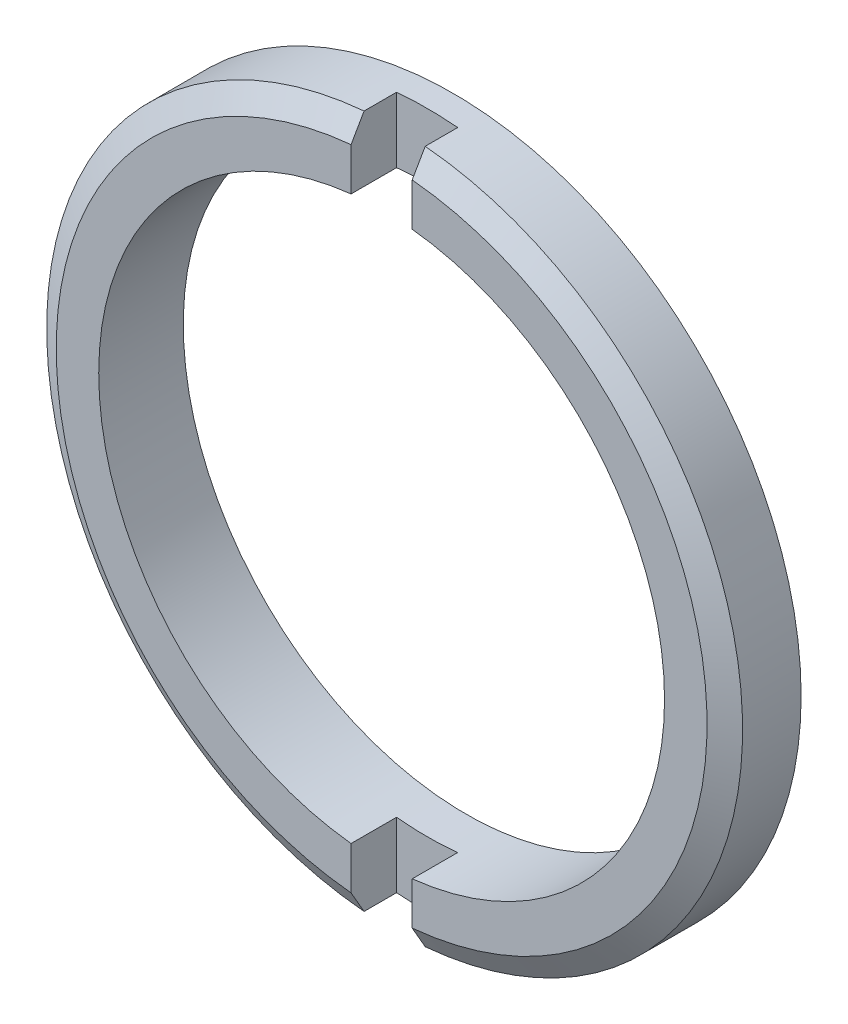
ISO-10303-21;
HEADER;
FILE_DESCRIPTION(('STEP AP214'),'2;1');
FILE_NAME('part.step','',(''),(''),'','','');
FILE_SCHEMA(('AUTOMOTIVE_DESIGN { 1 0 10303 214 1 1 1 1 }'));
ENDSEC;
DATA;
#1=APPLICATION_CONTEXT('core data for automotive mechanical design processes');
#2=APPLICATION_PROTOCOL_DEFINITION('international standard','automotive_design',2000,#1);
#3=PRODUCT_CONTEXT('',#1,'mechanical');
#4=PRODUCT('Part','Part','',(#3));
#5=PRODUCT_RELATED_PRODUCT_CATEGORY('part','',(#4));
#6=PRODUCT_DEFINITION_FORMATION('','',#4);
#7=PRODUCT_DEFINITION_CONTEXT('part definition',#1,'design');
#8=PRODUCT_DEFINITION('design','',#6,#7);
#9=PRODUCT_DEFINITION_SHAPE('','',#8);
#10=(LENGTH_UNIT() NAMED_UNIT(*) SI_UNIT(.MILLI.,.METRE.));
#11=(NAMED_UNIT(*) PLANE_ANGLE_UNIT() SI_UNIT($,.RADIAN.));
#12=(NAMED_UNIT(*) SI_UNIT($,.STERADIAN.) SOLID_ANGLE_UNIT());
#13=UNCERTAINTY_MEASURE_WITH_UNIT(LENGTH_MEASURE(1.E-05),#10,'distance_accuracy_value','');
#14=(GEOMETRIC_REPRESENTATION_CONTEXT(3) GLOBAL_UNCERTAINTY_ASSIGNED_CONTEXT((#13)) GLOBAL_UNIT_ASSIGNED_CONTEXT((#10,
#11,#12)) REPRESENTATION_CONTEXT('',''));
#15=CARTESIAN_POINT('',(0.,0.,0.));
#16=DIRECTION('',(0.,0.,1.));
#17=DIRECTION('',(1.,0.,0.));
#18=AXIS2_PLACEMENT_3D('',#15,#16,#17);
#19=CARTESIAN_POINT('',(0.,0.,0.8255));
#20=DIRECTION('',(0.,0.,1.));
#21=DIRECTION('',(1.,0.,0.));
#22=AXIS2_PLACEMENT_3D('',#19,#20,#21);
#23=PLANE('',#22);
#24=DIRECTION('',(0.,-1.,0.));
#25=VECTOR('',#24,1.);
#26=CARTESIAN_POINT('',(-0.5969,6.76823024431055,0.8255));
#27=LINE('',#26,#25);
#28=CARTESIAN_POINT('',(-0.5969,6.32646280952402,0.8255));
#29=VERTEX_POINT('',#28);
#30=CARTESIAN_POINT('',(-0.5969,5.4921590144496,0.8255));
#31=VERTEX_POINT('',#30);
#32=EDGE_CURVE('E169',#29,#31,#27,.T.);
#33=ORIENTED_EDGE('',*,*,#32,.F.);
#34=CARTESIAN_POINT('',(0.,0.,0.8255));
#35=DIRECTION('',(0.,0.,1.));
#36=DIRECTION('',(1.,0.,0.));
#37=AXIS2_PLACEMENT_3D('',#34,#35,#36);
#38=CIRCLE('',#37,6.35455909487751);
#39=CARTESIAN_POINT('',(-0.5969,-6.32646280952402,0.8255));
#40=VERTEX_POINT('',#39);
#41=EDGE_CURVE('E261',#29,#40,#38,.T.);
#42=ORIENTED_EDGE('',*,*,#41,.T.);
#43=DIRECTION('',(0.,-1.,0.));
#44=VECTOR('',#43,1.);
#45=CARTESIAN_POINT('',(-0.5969,-6.76823024431055,0.8255));
#46=LINE('',#45,#44);
#47=CARTESIAN_POINT('',(-0.5969,-5.4921590144496,0.8255));
#48=VERTEX_POINT('',#47);
#49=EDGE_CURVE('E145',#48,#40,#46,.T.);
#50=ORIENTED_EDGE('',*,*,#49,.F.);
#51=CARTESIAN_POINT('',(0.,0.,0.8255));
#52=DIRECTION('',(0.,0.,1.));
#53=DIRECTION('',(1.,0.,0.));
#54=AXIS2_PLACEMENT_3D('',#51,#52,#53);
#55=CIRCLE('',#54,5.5245);
#56=EDGE_CURVE('E184',#31,#48,#55,.T.);
#57=ORIENTED_EDGE('',*,*,#56,.F.);
#58=EDGE_LOOP('',(#33,#42,#50,#57));
#59=FACE_BOUND('',#58,.T.);
#60=ADVANCED_FACE('F43',(#59),#23,.T.);
#61=DIRECTION('',(0.,1.,0.));
#62=VECTOR('',#61,1.);
#63=CARTESIAN_POINT('',(0.5969,-6.76823024431055,0.8255));
#64=LINE('',#63,#62);
#65=CARTESIAN_POINT('',(0.5969,-6.32646280952402,0.8255));
#66=VERTEX_POINT('',#65);
#67=CARTESIAN_POINT('',(0.596899999999997,-5.4921590144496,0.8255));
#68=VERTEX_POINT('',#67);
#69=EDGE_CURVE('E345',#66,#68,#64,.T.);
#70=ORIENTED_EDGE('',*,*,#69,.F.);
#71=CARTESIAN_POINT('',(0.,0.,0.8255));
#72=DIRECTION('',(0.,0.,1.));
#73=DIRECTION('',(1.,0.,0.));
#74=AXIS2_PLACEMENT_3D('',#71,#72,#73);
#75=CIRCLE('',#74,6.35455909487751);
#76=CARTESIAN_POINT('',(0.5969,6.32646280952402,0.8255));
#77=VERTEX_POINT('',#76);
#78=EDGE_CURVE('E199',#66,#77,#75,.T.);
#79=ORIENTED_EDGE('',*,*,#78,.T.);
#80=DIRECTION('',(0.,1.,0.));
#81=VECTOR('',#80,1.);
#82=CARTESIAN_POINT('',(0.5969,6.76823024431055,0.8255));
#83=LINE('',#82,#81);
#84=CARTESIAN_POINT('',(0.5969,5.4921590144496,0.8255));
#85=VERTEX_POINT('',#84);
#86=EDGE_CURVE('E161',#85,#77,#83,.T.);
#87=ORIENTED_EDGE('',*,*,#86,.F.);
#88=EDGE_CURVE('E188',#68,#85,#55,.T.);
#89=ORIENTED_EDGE('',*,*,#88,.F.);
#90=EDGE_LOOP('',(#70,#79,#87,#89));
#91=FACE_BOUND('',#90,.T.);
#92=ADVANCED_FACE('F233',(#91),#23,.T.);
#93=CARTESIAN_POINT('',(0.,0.,-0.8255));
#94=DIRECTION('',(0.,0.,1.));
#95=DIRECTION('',(1.,0.,0.));
#96=AXIS2_PLACEMENT_3D('',#93,#94,#95);
#97=PLANE('',#96);
#98=CARTESIAN_POINT('',(0.,0.,-0.8255));
#99=DIRECTION('',(0.,0.,1.));
#100=DIRECTION('',(1.,0.,0.));
#101=AXIS2_PLACEMENT_3D('',#98,#99,#100);
#102=CIRCLE('',#101,6.35455909487751);
#103=CARTESIAN_POINT('',(6.35455909487751,0.,-0.8255));
#104=VERTEX_POINT('',#103);
#105=EDGE_CURVE('E196',#104,#104,#102,.F.);
#106=ORIENTED_EDGE('',*,*,#105,.T.);
#107=EDGE_LOOP('',(#106));
#108=FACE_BOUND('',#107,.T.);
#109=CARTESIAN_POINT('',(0.,0.,-0.8255));
#110=DIRECTION('',(0.,0.,1.));
#111=DIRECTION('',(1.,0.,0.));
#112=AXIS2_PLACEMENT_3D('',#109,#110,#111);
#113=CIRCLE('',#112,5.5245);
#114=CARTESIAN_POINT('',(5.5245,0.,-0.8255));
#115=VERTEX_POINT('',#114);
#116=EDGE_CURVE('E176',#115,#115,#113,.T.);
#117=ORIENTED_EDGE('',*,*,#116,.T.);
#118=EDGE_LOOP('',(#117));
#119=FACE_BOUND('',#118,.T.);
#120=ADVANCED_FACE('F236',(#108,#119),#97,.F.);
#121=CARTESIAN_POINT('',(0.,0.,0.8255));
#122=DIRECTION('',(0.,0.,-1.));
#123=DIRECTION('',(-1.,0.,0.));
#124=AXIS2_PLACEMENT_3D('',#121,#122,#123);
#125=CYLINDRICAL_SURFACE('',#124,6.7945);
#126=CARTESIAN_POINT('',(0.,0.,-0.571500000000005));
#127=DIRECTION('',(0.,0.,1.));
#128=DIRECTION('',(1.,0.,0.));
#129=AXIS2_PLACEMENT_3D('',#126,#127,#128);
#130=CIRCLE('',#129,6.7945);
#131=CARTESIAN_POINT('',(6.7945,0.,-0.571500000000005));
#132=VERTEX_POINT('',#131);
#133=EDGE_CURVE('E193',#132,#132,#130,.T.);
#134=ORIENTED_EDGE('',*,*,#133,.T.);
#135=EDGE_LOOP('',(#134));
#136=FACE_BOUND('',#135,.T.);
#137=DIRECTION('',(0.,0.,1.));
#138=VECTOR('',#137,1.);
#139=CARTESIAN_POINT('',(0.5969,6.76823024431055,-0.0635000000000001));
#140=LINE('',#139,#138);
#141=CARTESIAN_POINT('',(0.5969,6.76823024431055,-0.0635000000000001));
#142=VERTEX_POINT('',#141);
#143=CARTESIAN_POINT('',(0.5969,6.76823024431055,0.571500000000005));
#144=VERTEX_POINT('',#143);
#145=EDGE_CURVE('E174',#142,#144,#140,.T.);
#146=ORIENTED_EDGE('',*,*,#145,.T.);
#147=CARTESIAN_POINT('',(0.,0.,0.571500000000005));
#148=DIRECTION('',(0.,0.,1.));
#149=DIRECTION('',(1.,0.,0.));
#150=AXIS2_PLACEMENT_3D('',#147,#148,#149);
#151=CIRCLE('',#150,6.7945);
#152=CARTESIAN_POINT('',(0.5969,-6.76823024431055,0.571500000000005));
#153=VERTEX_POINT('',#152);
#154=EDGE_CURVE('E150',#144,#153,#151,.F.);
#155=ORIENTED_EDGE('',*,*,#154,.T.);
#156=DIRECTION('',(0.,0.,1.));
#157=VECTOR('',#156,1.);
#158=CARTESIAN_POINT('',(0.5969,-6.76823024431055,-0.0635000000000001));
#159=LINE('',#158,#157);
#160=CARTESIAN_POINT('',(0.5969,-6.76823024431055,-0.0635000000000001));
#161=VERTEX_POINT('',#160);
#162=EDGE_CURVE('E129',#161,#153,#159,.T.);
#163=ORIENTED_EDGE('',*,*,#162,.F.);
#164=CARTESIAN_POINT('',(0.,0.,-0.0635000000000001));
#165=DIRECTION('',(0.,0.,1.));
#166=DIRECTION('',(1.,0.,0.));
#167=AXIS2_PLACEMENT_3D('',#164,#165,#166);
#168=CIRCLE('',#167,6.7945);
#169=CARTESIAN_POINT('',(-0.5969,-6.76823024431055,-0.0635000000000001));
#170=VERTEX_POINT('',#169);
#171=EDGE_CURVE('E136',#170,#161,#168,.T.);
#172=ORIENTED_EDGE('',*,*,#171,.F.);
#173=DIRECTION('',(0.,0.,1.));
#174=VECTOR('',#173,1.);
#175=CARTESIAN_POINT('',(-0.5969,-6.76823024431055,-0.0635000000000001));
#176=LINE('',#175,#174);
#177=CARTESIAN_POINT('',(-0.5969,-6.76823024431055,0.571500000000005));
#178=VERTEX_POINT('',#177);
#179=EDGE_CURVE('E171',#170,#178,#176,.T.);
#180=ORIENTED_EDGE('',*,*,#179,.T.);
#181=CARTESIAN_POINT('',(0.,0.,0.571500000000005));
#182=DIRECTION('',(0.,0.,1.));
#183=DIRECTION('',(1.,0.,0.));
#184=AXIS2_PLACEMENT_3D('',#181,#182,#183);
#185=CIRCLE('',#184,6.7945);
#186=CARTESIAN_POINT('',(-0.5969,6.76823024431055,0.571500000000005));
#187=VERTEX_POINT('',#186);
#188=EDGE_CURVE('E187',#178,#187,#185,.F.);
#189=ORIENTED_EDGE('',*,*,#188,.T.);
#190=DIRECTION('',(0.,0.,1.));
#191=VECTOR('',#190,1.);
#192=CARTESIAN_POINT('',(-0.5969,6.76823024431055,-0.0635000000000001));
#193=LINE('',#192,#191);
#194=CARTESIAN_POINT('',(-0.5969,6.76823024431055,-0.0635000000000001));
#195=VERTEX_POINT('',#194);
#196=EDGE_CURVE('E168',#195,#187,#193,.T.);
#197=ORIENTED_EDGE('',*,*,#196,.F.);
#198=CARTESIAN_POINT('',(0.,0.,-0.0635000000000001));
#199=DIRECTION('',(0.,0.,1.));
#200=DIRECTION('',(1.,0.,0.));
#201=AXIS2_PLACEMENT_3D('',#198,#199,#200);
#202=CIRCLE('',#201,6.7945);
#203=EDGE_CURVE('E157',#142,#195,#202,.T.);
#204=ORIENTED_EDGE('',*,*,#203,.F.);
#205=EDGE_LOOP('',(#146,#155,#163,#172,#180,#189,#197,#204));
#206=FACE_BOUND('',#205,.T.);
#207=ADVANCED_FACE('F148',(#136,#206),#125,.T.);
#208=CARTESIAN_POINT('',(0.,0.,0.8255));
#209=DIRECTION('',(0.,0.,-1.));
#210=DIRECTION('',(-1.,0.,0.));
#211=AXIS2_PLACEMENT_3D('',#208,#209,#210);
#212=CYLINDRICAL_SURFACE('',#211,5.5245);
#213=DIRECTION('',(0.,0.,1.));
#214=VECTOR('',#213,1.);
#215=CARTESIAN_POINT('',(-0.5969,-5.4921590144496,-0.0635000000000001));
#216=LINE('',#215,#214);
#217=CARTESIAN_POINT('',(-0.5969,-5.4921590144496,-0.0635000000000001));
#218=VERTEX_POINT('',#217);
#219=EDGE_CURVE('E152',#218,#48,#216,.T.);
#220=ORIENTED_EDGE('',*,*,#219,.F.);
#221=CARTESIAN_POINT('',(0.,0.,-0.0635000000000001));
#222=DIRECTION('',(0.,0.,-1.));
#223=DIRECTION('',(1.,0.,0.));
#224=AXIS2_PLACEMENT_3D('',#221,#222,#223);
#225=CIRCLE('',#224,5.5245);
#226=CARTESIAN_POINT('',(0.596899999999997,-5.4921590144496,-0.0635000000000001));
#227=VERTEX_POINT('',#226);
#228=EDGE_CURVE('E135',#227,#218,#225,.T.);
#229=ORIENTED_EDGE('',*,*,#228,.F.);
#230=DIRECTION('',(0.,0.,1.));
#231=VECTOR('',#230,1.);
#232=CARTESIAN_POINT('',(0.596899999999997,-5.4921590144496,-0.0635000000000001));
#233=LINE('',#232,#231);
#234=EDGE_CURVE('E132',#227,#68,#233,.T.);
#235=ORIENTED_EDGE('',*,*,#234,.T.);
#236=ORIENTED_EDGE('',*,*,#88,.T.);
#237=DIRECTION('',(0.,0.,1.));
#238=VECTOR('',#237,1.);
#239=CARTESIAN_POINT('',(0.5969,5.4921590144496,-0.0635000000000001));
#240=LINE('',#239,#238);
#241=CARTESIAN_POINT('',(0.5969,5.4921590144496,-0.0635000000000001));
#242=VERTEX_POINT('',#241);
#243=EDGE_CURVE('E177',#242,#85,#240,.T.);
#244=ORIENTED_EDGE('',*,*,#243,.F.);
#245=CARTESIAN_POINT('',(0.,0.,-0.0635000000000001));
#246=DIRECTION('',(0.,0.,-1.));
#247=DIRECTION('',(1.,0.,0.));
#248=AXIS2_PLACEMENT_3D('',#245,#246,#247);
#249=CIRCLE('',#248,5.5245);
#250=CARTESIAN_POINT('',(-0.5969,5.4921590144496,-0.0635000000000001));
#251=VERTEX_POINT('',#250);
#252=EDGE_CURVE('E163',#251,#242,#249,.T.);
#253=ORIENTED_EDGE('',*,*,#252,.F.);
#254=DIRECTION('',(0.,0.,1.));
#255=VECTOR('',#254,1.);
#256=CARTESIAN_POINT('',(-0.5969,5.4921590144496,-0.0635000000000001));
#257=LINE('',#256,#255);
#258=EDGE_CURVE('E180',#251,#31,#257,.T.);
#259=ORIENTED_EDGE('',*,*,#258,.T.);
#260=ORIENTED_EDGE('',*,*,#56,.T.);
#261=EDGE_LOOP('',(#220,#229,#235,#236,#244,#253,#259,#260));
#262=FACE_BOUND('',#261,.T.);
#263=ORIENTED_EDGE('',*,*,#116,.F.);
#264=EDGE_LOOP('',(#263));
#265=FACE_BOUND('',#264,.T.);
#266=ADVANCED_FACE('F224',(#262,#265),#212,.F.);
#267=CARTESIAN_POINT('',(0.5969,6.76823024431055,-0.0635000000000001));
#268=DIRECTION('',(1.,0.,0.));
#269=DIRECTION('',(0.,1.,0.));
#270=AXIS2_PLACEMENT_3D('',#267,#268,#269);
#271=PLANE('',#270);
#272=ORIENTED_EDGE('',*,*,#86,.T.);
#273=CARTESIAN_POINT('',(0.5969,6.32646280952402,0.8255));
#274=CARTESIAN_POINT('',(0.5969,6.40009580798033,0.783175524011034));
#275=CARTESIAN_POINT('',(0.5969,6.47372626011182,0.740846619347321));
#276=CARTESIAN_POINT('',(0.5969,6.62098207170733,0.656179952680655));
#277=CARTESIAN_POINT('',(0.5969,6.69460743117135,0.613842190677702));
#278=CARTESIAN_POINT('',(0.5969,6.76823024431055,0.571500000000006));
#279=B_SPLINE_CURVE_WITH_KNOTS('',3,(#273,#274,#275,#276,#277,#278),.UNSPECIFIED.,.F.,.F.,(4,2,
4),(0.,0.254791320221188,0.509582640380692),.UNSPECIFIED.);
#280=EDGE_CURVE('E202',#77,#144,#279,.T.);
#281=ORIENTED_EDGE('',*,*,#280,.T.);
#282=ORIENTED_EDGE('',*,*,#145,.F.);
#283=DIRECTION('',(0.,1.,0.));
#284=VECTOR('',#283,1.);
#285=CARTESIAN_POINT('',(0.5969,6.76823024431055,-0.0635000000000001));
#286=LINE('',#285,#284);
#287=EDGE_CURVE('E165',#242,#142,#286,.T.);
#288=ORIENTED_EDGE('',*,*,#287,.F.);
#289=ORIENTED_EDGE('',*,*,#243,.T.);
#290=EDGE_LOOP('',(#272,#281,#282,#288,#289));
#291=FACE_BOUND('',#290,.T.);
#292=ADVANCED_FACE('F219',(#291),#271,.F.);
#293=CARTESIAN_POINT('',(-0.5969,6.76823024431055,-0.0635000000000001));
#294=DIRECTION('',(-1.,0.,0.));
#295=DIRECTION('',(0.,-1.,0.));
#296=AXIS2_PLACEMENT_3D('',#293,#294,#295);
#297=PLANE('',#296);
#298=ORIENTED_EDGE('',*,*,#196,.T.);
#299=CARTESIAN_POINT('',(-0.5969,6.76823024431055,0.571500000000005));
#300=CARTESIAN_POINT('',(-0.5969,6.69460743117135,0.613842190677702));
#301=CARTESIAN_POINT('',(-0.5969,6.62098207170733,0.656179952680655));
#302=CARTESIAN_POINT('',(-0.5969,6.47372626011182,0.740846619347321));
#303=CARTESIAN_POINT('',(-0.5969,6.40009580798033,0.783175524011034));
#304=CARTESIAN_POINT('',(-0.5969,6.32646280952402,0.8255));
#305=B_SPLINE_CURVE_WITH_KNOTS('',3,(#299,#300,#301,#302,#303,#304),.UNSPECIFIED.,.F.,.F.,(4,2,
4),(0.,0.254791320159504,0.509582640380692),.UNSPECIFIED.);
#306=EDGE_CURVE('E11',#187,#29,#305,.T.);
#307=ORIENTED_EDGE('',*,*,#306,.T.);
#308=ORIENTED_EDGE('',*,*,#32,.T.);
#309=ORIENTED_EDGE('',*,*,#258,.F.);
#310=DIRECTION('',(0.,-1.,0.));
#311=VECTOR('',#310,1.);
#312=CARTESIAN_POINT('',(-0.5969,6.76823024431055,-0.0635000000000001));
#313=LINE('',#312,#311);
#314=EDGE_CURVE('E160',#195,#251,#313,.T.);
#315=ORIENTED_EDGE('',*,*,#314,.F.);
#316=EDGE_LOOP('',(#298,#307,#308,#309,#315));
#317=FACE_BOUND('',#316,.T.);
#318=ADVANCED_FACE('F223',(#317),#297,.F.);
#319=CARTESIAN_POINT('',(0.,0.,-0.0635000000000001));
#320=DIRECTION('',(0.,0.,1.));
#321=DIRECTION('',(1.,0.,0.));
#322=AXIS2_PLACEMENT_3D('',#319,#320,#321);
#323=PLANE('',#322);
#324=ORIENTED_EDGE('',*,*,#203,.T.);
#325=ORIENTED_EDGE('',*,*,#314,.T.);
#326=ORIENTED_EDGE('',*,*,#252,.T.);
#327=ORIENTED_EDGE('',*,*,#287,.T.);
#328=EDGE_LOOP('',(#324,#325,#326,#327));
#329=FACE_BOUND('',#328,.T.);
#330=ADVANCED_FACE('F226',(#329),#323,.T.);
#331=CARTESIAN_POINT('',(-0.5969,-6.76823024431055,-0.0635000000000001));
#332=DIRECTION('',(-1.,0.,0.));
#333=DIRECTION('',(0.,-1.,0.));
#334=AXIS2_PLACEMENT_3D('',#331,#332,#333);
#335=PLANE('',#334);
#336=ORIENTED_EDGE('',*,*,#49,.T.);
#337=CARTESIAN_POINT('',(-0.5969,-6.32646280952402,0.8255));
#338=CARTESIAN_POINT('',(-0.5969,-6.40009580798033,0.783175524011034));
#339=CARTESIAN_POINT('',(-0.5969,-6.47372626011182,0.740846619347321));
#340=CARTESIAN_POINT('',(-0.5969,-6.62098207170733,0.656179952680655));
#341=CARTESIAN_POINT('',(-0.5969,-6.69460743117135,0.613842190677702));
#342=CARTESIAN_POINT('',(-0.5969,-6.76823024431055,0.571500000000006));
#343=B_SPLINE_CURVE_WITH_KNOTS('',3,(#337,#338,#339,#340,#341,#342),.UNSPECIFIED.,.F.,.F.,(4,2,
4),(0.,0.254791320221188,0.509582640380692),.UNSPECIFIED.);
#344=EDGE_CURVE('E57',#40,#178,#343,.T.);
#345=ORIENTED_EDGE('',*,*,#344,.T.);
#346=ORIENTED_EDGE('',*,*,#179,.F.);
#347=DIRECTION('',(0.,-1.,0.));
#348=VECTOR('',#347,1.);
#349=CARTESIAN_POINT('',(-0.5969,-6.76823024431055,-0.0635000000000001));
#350=LINE('',#349,#348);
#351=EDGE_CURVE('E142',#218,#170,#350,.T.);
#352=ORIENTED_EDGE('',*,*,#351,.F.);
#353=ORIENTED_EDGE('',*,*,#219,.T.);
#354=EDGE_LOOP('',(#336,#345,#346,#352,#353));
#355=FACE_BOUND('',#354,.T.);
#356=ADVANCED_FACE('F269',(#355),#335,.F.);
#357=CARTESIAN_POINT('',(0.5969,-6.76823024431055,-0.0635000000000001));
#358=DIRECTION('',(1.,0.,0.));
#359=DIRECTION('',(0.,1.,0.));
#360=AXIS2_PLACEMENT_3D('',#357,#358,#359);
#361=PLANE('',#360);
#362=ORIENTED_EDGE('',*,*,#162,.T.);
#363=CARTESIAN_POINT('',(0.5969,-6.76823024431055,0.571500000000005));
#364=CARTESIAN_POINT('',(0.5969,-6.69460743117135,0.613842190677702));
#365=CARTESIAN_POINT('',(0.5969,-6.62098207170733,0.656179952680655));
#366=CARTESIAN_POINT('',(0.5969,-6.47372626011182,0.740846619347321));
#367=CARTESIAN_POINT('',(0.5969,-6.40009580798033,0.783175524011034));
#368=CARTESIAN_POINT('',(0.5969,-6.32646280952402,0.8255));
#369=B_SPLINE_CURVE_WITH_KNOTS('',3,(#363,#364,#365,#366,#367,#368),.UNSPECIFIED.,.F.,.F.,(4,2,
4),(0.,0.254791320159504,0.509582640380692),.UNSPECIFIED.);
#370=EDGE_CURVE('E209',#153,#66,#369,.T.);
#371=ORIENTED_EDGE('',*,*,#370,.T.);
#372=ORIENTED_EDGE('',*,*,#69,.T.);
#373=ORIENTED_EDGE('',*,*,#234,.F.);
#374=DIRECTION('',(0.,1.,0.));
#375=VECTOR('',#374,1.);
#376=CARTESIAN_POINT('',(0.5969,-6.76823024431055,-0.0635000000000001));
#377=LINE('',#376,#375);
#378=EDGE_CURVE('E125',#161,#227,#377,.T.);
#379=ORIENTED_EDGE('',*,*,#378,.F.);
#380=EDGE_LOOP('',(#362,#371,#372,#373,#379));
#381=FACE_BOUND('',#380,.T.);
#382=ADVANCED_FACE('F127',(#381),#361,.F.);
#383=CARTESIAN_POINT('',(0.,0.,-0.0635000000000001));
#384=DIRECTION('',(0.,0.,1.));
#385=DIRECTION('',(1.,0.,0.));
#386=AXIS2_PLACEMENT_3D('',#383,#384,#385);
#387=PLANE('',#386);
#388=ORIENTED_EDGE('',*,*,#171,.T.);
#389=ORIENTED_EDGE('',*,*,#378,.T.);
#390=ORIENTED_EDGE('',*,*,#228,.T.);
#391=ORIENTED_EDGE('',*,*,#351,.T.);
#392=EDGE_LOOP('',(#388,#389,#390,#391));
#393=FACE_BOUND('',#392,.T.);
#394=ADVANCED_FACE('F140',(#393),#387,.T.);
#395=CARTESIAN_POINT('',(0.,0.,-0.571500000000005));
#396=DIRECTION('',(0.,0.,1.));
#397=DIRECTION('',(1.,0.,0.));
#398=AXIS2_PLACEMENT_3D('',#395,#396,#397);
#399=CONICAL_SURFACE('',#398,6.7945,1.0471975511966);
#400=ORIENTED_EDGE('',*,*,#105,.F.);
#401=EDGE_LOOP('',(#400));
#402=FACE_BOUND('',#401,.T.);
#403=ORIENTED_EDGE('',*,*,#133,.F.);
#404=EDGE_LOOP('',(#403));
#405=FACE_BOUND('',#404,.T.);
#406=ADVANCED_FACE('F243',(#402,#405),#399,.T.);
#407=CARTESIAN_POINT('',(0.,0.,0.8255));
#408=DIRECTION('',(0.,0.,-1.));
#409=DIRECTION('',(-1.,0.,0.));
#410=AXIS2_PLACEMENT_3D('',#407,#408,#409);
#411=CONICAL_SURFACE('',#410,6.35455909487751,1.0471975511966);
#412=ORIENTED_EDGE('',*,*,#370,.F.);
#413=ORIENTED_EDGE('',*,*,#154,.F.);
#414=ORIENTED_EDGE('',*,*,#280,.F.);
#415=ORIENTED_EDGE('',*,*,#78,.F.);
#416=EDGE_LOOP('',(#412,#413,#414,#415));
#417=FACE_BOUND('',#416,.T.);
#418=ADVANCED_FACE('F216',(#417),#411,.T.);
#419=CARTESIAN_POINT('',(0.,0.,0.8255));
#420=DIRECTION('',(0.,0.,-1.));
#421=DIRECTION('',(-1.,0.,0.));
#422=AXIS2_PLACEMENT_3D('',#419,#420,#421);
#423=CONICAL_SURFACE('',#422,6.35455909487751,1.0471975511966);
#424=ORIENTED_EDGE('',*,*,#306,.F.);
#425=ORIENTED_EDGE('',*,*,#188,.F.);
#426=ORIENTED_EDGE('',*,*,#344,.F.);
#427=ORIENTED_EDGE('',*,*,#41,.F.);
#428=EDGE_LOOP('',(#424,#425,#426,#427));
#429=FACE_BOUND('',#428,.T.);
#430=ADVANCED_FACE('F45',(#429),#423,.T.);
#431=CLOSED_SHELL('',(#60,#92,#120,#207,#266,#292,#318,#330,#356,#382,#394,#406,#418,#430));
#432=MANIFOLD_SOLID_BREP('B2',#431);
#433=ADVANCED_BREP_SHAPE_REPRESENTATION('',(#18,#432),#14);
#434=SHAPE_DEFINITION_REPRESENTATION(#9,#433);
ENDSEC;
END-ISO-10303-21;
